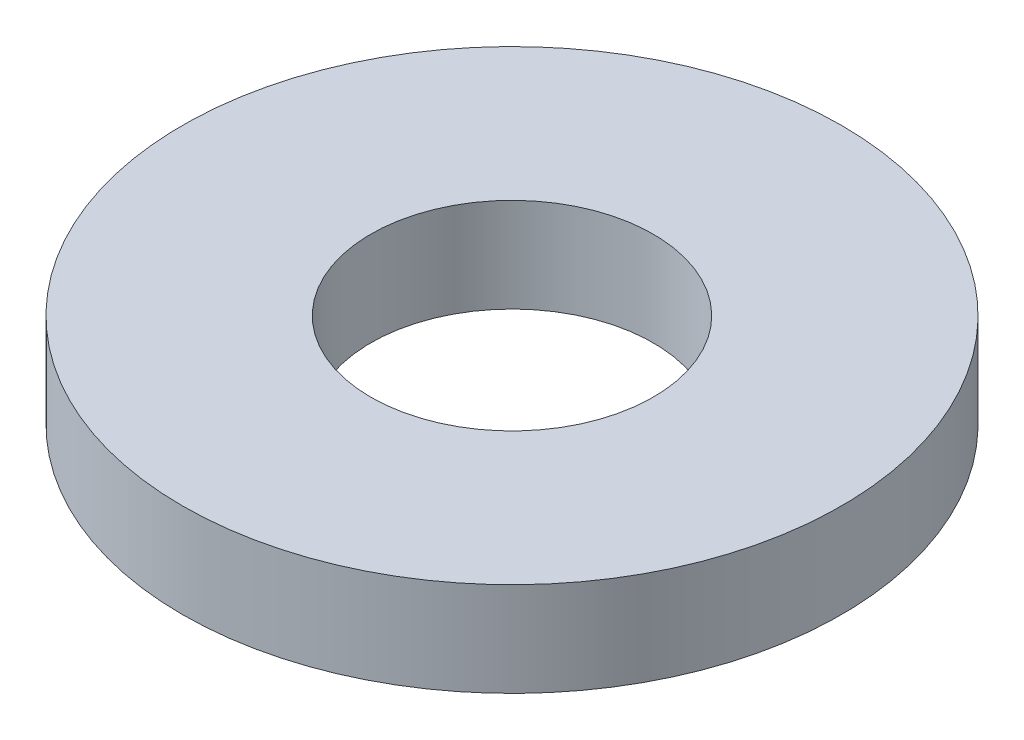
ISO-10303-21;
HEADER;
FILE_DESCRIPTION(('STEP AP214'),'2;1');
FILE_NAME('part.step','',(''),(''),'','','');
FILE_SCHEMA(('AUTOMOTIVE_DESIGN { 1 0 10303 214 1 1 1 1 }'));
ENDSEC;
DATA;
#1=APPLICATION_CONTEXT('core data for automotive mechanical design processes');
#2=APPLICATION_PROTOCOL_DEFINITION('international standard','automotive_design',2000,#1);
#3=PRODUCT_CONTEXT('',#1,'mechanical');
#4=PRODUCT('Part','Part','',(#3));
#5=PRODUCT_RELATED_PRODUCT_CATEGORY('part','',(#4));
#6=PRODUCT_DEFINITION_FORMATION('','',#4);
#7=PRODUCT_DEFINITION_CONTEXT('part definition',#1,'design');
#8=PRODUCT_DEFINITION('design','',#6,#7);
#9=PRODUCT_DEFINITION_SHAPE('','',#8);
#10=(LENGTH_UNIT() NAMED_UNIT(*) SI_UNIT(.MILLI.,.METRE.));
#11=(NAMED_UNIT(*) PLANE_ANGLE_UNIT() SI_UNIT($,.RADIAN.));
#12=(NAMED_UNIT(*) SI_UNIT($,.STERADIAN.) SOLID_ANGLE_UNIT());
#13=UNCERTAINTY_MEASURE_WITH_UNIT(LENGTH_MEASURE(1.E-05),#10,'distance_accuracy_value','');
#14=(GEOMETRIC_REPRESENTATION_CONTEXT(3) GLOBAL_UNCERTAINTY_ASSIGNED_CONTEXT((#13)) GLOBAL_UNIT_ASSIGNED_CONTEXT((#10,
#11,#12)) REPRESENTATION_CONTEXT('',''));
#15=CARTESIAN_POINT('',(0.,0.,0.));
#16=DIRECTION('',(0.,0.,1.));
#17=DIRECTION('',(1.,0.,0.));
#18=AXIS2_PLACEMENT_3D('',#15,#16,#17);
#19=CARTESIAN_POINT('',(0.,1.,0.));
#20=DIRECTION('',(0.,-1.,0.));
#21=DIRECTION('',(0.,0.,-1.));
#22=AXIS2_PLACEMENT_3D('',#19,#20,#21);
#23=CYLINDRICAL_SURFACE('',#22,3.5);
#24=CARTESIAN_POINT('',(0.,1.,0.));
#25=DIRECTION('',(0.,1.,0.));
#26=DIRECTION('',(0.,0.,1.));
#27=AXIS2_PLACEMENT_3D('',#24,#25,#26);
#28=CIRCLE('',#27,3.5);
#29=CARTESIAN_POINT('',(0.,1.,3.5));
#30=VERTEX_POINT('',#29);
#31=EDGE_CURVE('E10',#30,#30,#28,.T.);
#32=ORIENTED_EDGE('',*,*,#31,.F.);
#33=EDGE_LOOP('',(#32));
#34=FACE_BOUND('',#33,.T.);
#35=CARTESIAN_POINT('',(0.,0.,0.));
#36=DIRECTION('',(0.,1.,0.));
#37=DIRECTION('',(0.,0.,1.));
#38=AXIS2_PLACEMENT_3D('',#35,#36,#37);
#39=CIRCLE('',#38,3.5);
#40=CARTESIAN_POINT('',(0.,0.,3.5));
#41=VERTEX_POINT('',#40);
#42=EDGE_CURVE('E34',#41,#41,#39,.T.);
#43=ORIENTED_EDGE('',*,*,#42,.T.);
#44=EDGE_LOOP('',(#43));
#45=FACE_BOUND('',#44,.T.);
#46=ADVANCED_FACE('F31',(#34,#45),#23,.T.);
#47=CARTESIAN_POINT('',(0.,1.,0.));
#48=DIRECTION('',(0.,1.,0.));
#49=DIRECTION('',(0.,0.,1.));
#50=AXIS2_PLACEMENT_3D('',#47,#48,#49);
#51=PLANE('',#50);
#52=CARTESIAN_POINT('',(0.,1.,0.));
#53=DIRECTION('',(0.,1.,0.));
#54=DIRECTION('',(0.,0.,1.));
#55=AXIS2_PLACEMENT_3D('',#52,#53,#54);
#56=CIRCLE('',#55,1.5);
#57=CARTESIAN_POINT('',(0.,1.,1.5));
#58=VERTEX_POINT('',#57);
#59=EDGE_CURVE('E43',#58,#58,#56,.T.);
#60=ORIENTED_EDGE('',*,*,#59,.F.);
#61=EDGE_LOOP('',(#60));
#62=FACE_BOUND('',#61,.T.);
#63=ORIENTED_EDGE('',*,*,#31,.T.);
#64=EDGE_LOOP('',(#63));
#65=FACE_BOUND('',#64,.T.);
#66=ADVANCED_FACE('F58',(#62,#65),#51,.T.);
#67=CARTESIAN_POINT('',(0.,0.,0.));
#68=DIRECTION('',(0.,1.,0.));
#69=DIRECTION('',(0.,0.,1.));
#70=AXIS2_PLACEMENT_3D('',#67,#68,#69);
#71=PLANE('',#70);
#72=CARTESIAN_POINT('',(0.,0.,0.));
#73=DIRECTION('',(0.,1.,0.));
#74=DIRECTION('',(0.,0.,1.));
#75=AXIS2_PLACEMENT_3D('',#72,#73,#74);
#76=CIRCLE('',#75,1.5);
#77=CARTESIAN_POINT('',(0.,0.,1.5));
#78=VERTEX_POINT('',#77);
#79=EDGE_CURVE('E41',#78,#78,#76,.T.);
#80=ORIENTED_EDGE('',*,*,#79,.T.);
#81=EDGE_LOOP('',(#80));
#82=FACE_BOUND('',#81,.T.);
#83=ORIENTED_EDGE('',*,*,#42,.F.);
#84=EDGE_LOOP('',(#83));
#85=FACE_BOUND('',#84,.T.);
#86=ADVANCED_FACE('F49',(#82,#85),#71,.F.);
#87=CARTESIAN_POINT('',(0.,0.,0.));
#88=DIRECTION('',(0.,1.,0.));
#89=DIRECTION('',(0.,0.,1.));
#90=AXIS2_PLACEMENT_3D('',#87,#88,#89);
#91=CYLINDRICAL_SURFACE('',#90,1.5);
#92=ORIENTED_EDGE('',*,*,#79,.F.);
#93=EDGE_LOOP('',(#92));
#94=FACE_BOUND('',#93,.T.);
#95=ORIENTED_EDGE('',*,*,#59,.T.);
#96=EDGE_LOOP('',(#95));
#97=FACE_BOUND('',#96,.T.);
#98=ADVANCED_FACE('F52',(#94,#97),#91,.F.);
#99=CLOSED_SHELL('',(#46,#66,#86,#98));
#100=MANIFOLD_SOLID_BREP('B2',#99);
#101=ADVANCED_BREP_SHAPE_REPRESENTATION('',(#18,#100),#14);
#102=SHAPE_DEFINITION_REPRESENTATION(#9,#101);
ENDSEC;
END-ISO-10303-21;
